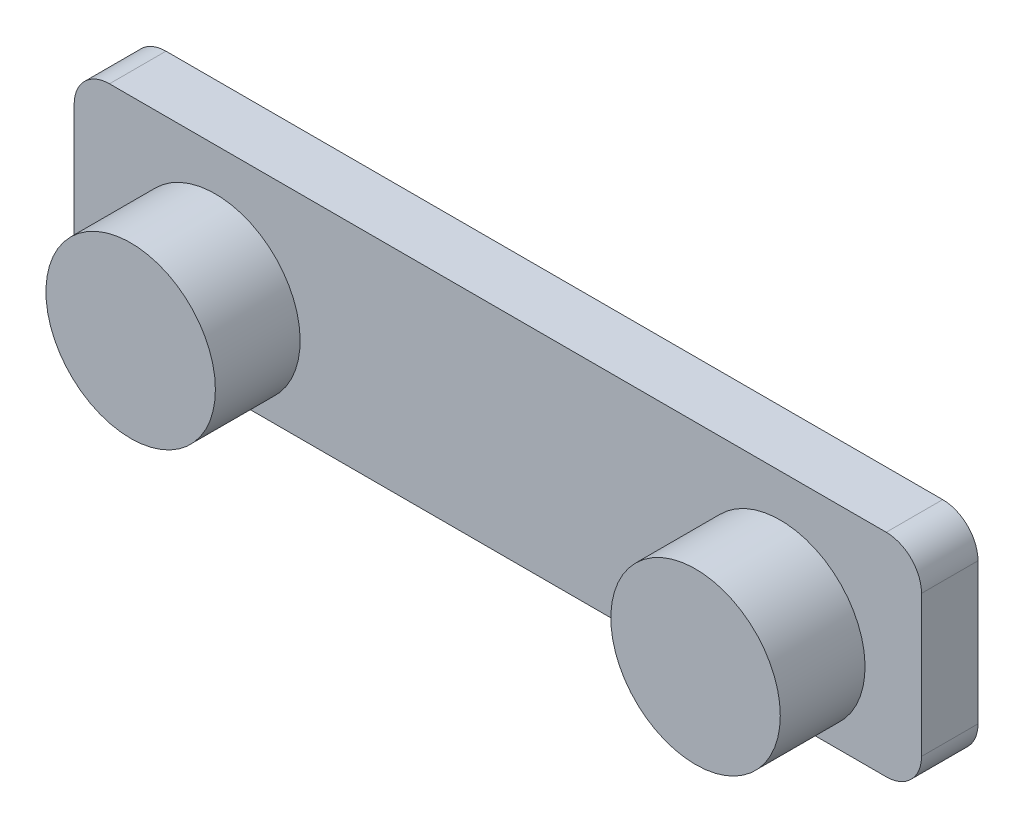
ISO-10303-21;
HEADER;
FILE_DESCRIPTION(('STEP AP214'),'2;1');
FILE_NAME('part.step','',(''),(''),'','','');
FILE_SCHEMA(('AUTOMOTIVE_DESIGN { 1 0 10303 214 1 1 1 1 }'));
ENDSEC;
DATA;
#1=APPLICATION_CONTEXT('core data for automotive mechanical design processes');
#2=APPLICATION_PROTOCOL_DEFINITION('international standard','automotive_design',2000,#1);
#3=PRODUCT_CONTEXT('',#1,'mechanical');
#4=PRODUCT('Part','Part','',(#3));
#5=PRODUCT_RELATED_PRODUCT_CATEGORY('part','',(#4));
#6=PRODUCT_DEFINITION_FORMATION('','',#4);
#7=PRODUCT_DEFINITION_CONTEXT('part definition',#1,'design');
#8=PRODUCT_DEFINITION('design','',#6,#7);
#9=PRODUCT_DEFINITION_SHAPE('','',#8);
#10=(LENGTH_UNIT() NAMED_UNIT(*) SI_UNIT(.MILLI.,.METRE.));
#11=(NAMED_UNIT(*) PLANE_ANGLE_UNIT() SI_UNIT($,.RADIAN.));
#12=(NAMED_UNIT(*) SI_UNIT($,.STERADIAN.) SOLID_ANGLE_UNIT());
#13=UNCERTAINTY_MEASURE_WITH_UNIT(LENGTH_MEASURE(1.E-05),#10,'distance_accuracy_value','');
#14=(GEOMETRIC_REPRESENTATION_CONTEXT(3) GLOBAL_UNCERTAINTY_ASSIGNED_CONTEXT((#13)) GLOBAL_UNIT_ASSIGNED_CONTEXT((#10,
#11,#12)) REPRESENTATION_CONTEXT('',''));
#15=CARTESIAN_POINT('',(0.,0.,0.));
#16=DIRECTION('',(0.,0.,1.));
#17=DIRECTION('',(1.,0.,0.));
#18=AXIS2_PLACEMENT_3D('',#15,#16,#17);
#19=CARTESIAN_POINT('',(85.,25.,8.));
#20=DIRECTION('',(0.,0.,-1.));
#21=DIRECTION('',(-1.,0.,0.));
#22=AXIS2_PLACEMENT_3D('',#19,#20,#21);
#23=CYLINDRICAL_SURFACE('',#22,5.);
#24=CARTESIAN_POINT('',(85.,25.,0.));
#25=DIRECTION('',(0.,0.,1.));
#26=DIRECTION('',(1.,0.,0.));
#27=AXIS2_PLACEMENT_3D('',#24,#25,#26);
#28=CIRCLE('',#27,5.);
#29=CARTESIAN_POINT('',(85.,30.,0.));
#30=VERTEX_POINT('',#29);
#31=CARTESIAN_POINT('',(80.,25.,0.));
#32=VERTEX_POINT('',#31);
#33=EDGE_CURVE('E130',#30,#32,#28,.T.);
#34=ORIENTED_EDGE('',*,*,#33,.T.);
#35=DIRECTION('',(0.,0.,-1.));
#36=VECTOR('',#35,1.);
#37=CARTESIAN_POINT('',(80.,25.,8.));
#38=LINE('',#37,#36);
#39=CARTESIAN_POINT('',(80.,25.,8.));
#40=VERTEX_POINT('',#39);
#41=EDGE_CURVE('E11',#40,#32,#38,.T.);
#42=ORIENTED_EDGE('',*,*,#41,.F.);
#43=CARTESIAN_POINT('',(85.,25.,8.));
#44=DIRECTION('',(0.,0.,1.));
#45=DIRECTION('',(1.,0.,0.));
#46=AXIS2_PLACEMENT_3D('',#43,#44,#45);
#47=CIRCLE('',#46,5.);
#48=CARTESIAN_POINT('',(85.,30.,8.));
#49=VERTEX_POINT('',#48);
#50=EDGE_CURVE('E117',#49,#40,#47,.T.);
#51=ORIENTED_EDGE('',*,*,#50,.F.);
#52=DIRECTION('',(0.,0.,-1.));
#53=VECTOR('',#52,1.);
#54=CARTESIAN_POINT('',(85.,30.,8.));
#55=LINE('',#54,#53);
#56=EDGE_CURVE('E131',#49,#30,#55,.T.);
#57=ORIENTED_EDGE('',*,*,#56,.T.);
#58=EDGE_LOOP('',(#34,#42,#51,#57));
#59=FACE_BOUND('',#58,.T.);
#60=ADVANCED_FACE('F41',(#59),#23,.T.);
#61=CARTESIAN_POINT('',(80.,25.,8.));
#62=DIRECTION('',(1.,0.,0.));
#63=DIRECTION('',(0.,0.,-1.));
#64=AXIS2_PLACEMENT_3D('',#61,#62,#63);
#65=PLANE('',#64);
#66=DIRECTION('',(0.,-1.,0.));
#67=VECTOR('',#66,1.);
#68=CARTESIAN_POINT('',(80.,25.,0.));
#69=LINE('',#68,#67);
#70=CARTESIAN_POINT('',(80.,5.,0.));
#71=VERTEX_POINT('',#70);
#72=EDGE_CURVE('E134',#32,#71,#69,.T.);
#73=ORIENTED_EDGE('',*,*,#72,.T.);
#74=DIRECTION('',(0.,0.,-1.));
#75=VECTOR('',#74,1.);
#76=CARTESIAN_POINT('',(80.,5.,8.));
#77=LINE('',#76,#75);
#78=CARTESIAN_POINT('',(80.,5.,8.));
#79=VERTEX_POINT('',#78);
#80=EDGE_CURVE('E48',#79,#71,#77,.T.);
#81=ORIENTED_EDGE('',*,*,#80,.F.);
#82=DIRECTION('',(0.,-1.,0.));
#83=VECTOR('',#82,1.);
#84=CARTESIAN_POINT('',(80.,25.,8.));
#85=LINE('',#84,#83);
#86=EDGE_CURVE('E108',#40,#79,#85,.T.);
#87=ORIENTED_EDGE('',*,*,#86,.F.);
#88=ORIENTED_EDGE('',*,*,#41,.T.);
#89=EDGE_LOOP('',(#73,#81,#87,#88));
#90=FACE_BOUND('',#89,.T.);
#91=ADVANCED_FACE('F110',(#90),#65,.F.);
#92=CARTESIAN_POINT('',(85.,5.,8.));
#93=DIRECTION('',(0.,0.,-1.));
#94=DIRECTION('',(-1.,0.,0.));
#95=AXIS2_PLACEMENT_3D('',#92,#93,#94);
#96=CYLINDRICAL_SURFACE('',#95,5.);
#97=CARTESIAN_POINT('',(85.,5.,0.));
#98=DIRECTION('',(0.,0.,1.));
#99=DIRECTION('',(-1.,0.,0.));
#100=AXIS2_PLACEMENT_3D('',#97,#98,#99);
#101=CIRCLE('',#100,5.);
#102=CARTESIAN_POINT('',(85.,0.,0.));
#103=VERTEX_POINT('',#102);
#104=EDGE_CURVE('E136',#71,#103,#101,.T.);
#105=ORIENTED_EDGE('',*,*,#104,.T.);
#106=DIRECTION('',(0.,0.,-1.));
#107=VECTOR('',#106,1.);
#108=CARTESIAN_POINT('',(85.,0.,8.));
#109=LINE('',#108,#107);
#110=CARTESIAN_POINT('',(85.,0.,8.));
#111=VERTEX_POINT('',#110);
#112=EDGE_CURVE('E166',#111,#103,#109,.T.);
#113=ORIENTED_EDGE('',*,*,#112,.F.);
#114=CARTESIAN_POINT('',(85.,5.,8.));
#115=DIRECTION('',(0.,0.,1.));
#116=DIRECTION('',(-1.,0.,0.));
#117=AXIS2_PLACEMENT_3D('',#114,#115,#116);
#118=CIRCLE('',#117,5.);
#119=EDGE_CURVE('E116',#79,#111,#118,.T.);
#120=ORIENTED_EDGE('',*,*,#119,.F.);
#121=ORIENTED_EDGE('',*,*,#80,.T.);
#122=EDGE_LOOP('',(#105,#113,#120,#121));
#123=FACE_BOUND('',#122,.T.);
#124=ADVANCED_FACE('F170',(#123),#96,.T.);
#125=CARTESIAN_POINT('',(85.,0.,8.));
#126=DIRECTION('',(0.,1.,0.));
#127=DIRECTION('',(0.,0.,1.));
#128=AXIS2_PLACEMENT_3D('',#125,#126,#127);
#129=PLANE('',#128);
#130=DIRECTION('',(1.,0.,0.));
#131=VECTOR('',#130,1.);
#132=CARTESIAN_POINT('',(85.,0.,0.));
#133=LINE('',#132,#131);
#134=CARTESIAN_POINT('',(195.,0.,0.));
#135=VERTEX_POINT('',#134);
#136=EDGE_CURVE('E144',#103,#135,#133,.T.);
#137=ORIENTED_EDGE('',*,*,#136,.T.);
#138=DIRECTION('',(0.,0.,-1.));
#139=VECTOR('',#138,1.);
#140=CARTESIAN_POINT('',(195.,0.,8.));
#141=LINE('',#140,#139);
#142=CARTESIAN_POINT('',(195.,0.,8.));
#143=VERTEX_POINT('',#142);
#144=EDGE_CURVE('E163',#143,#135,#141,.T.);
#145=ORIENTED_EDGE('',*,*,#144,.F.);
#146=DIRECTION('',(1.,0.,0.));
#147=VECTOR('',#146,1.);
#148=CARTESIAN_POINT('',(85.,0.,8.));
#149=LINE('',#148,#147);
#150=CARTESIAN_POINT('',(180.,0.,8.));
#151=VERTEX_POINT('',#150);
#152=EDGE_CURVE('E195',#151,#143,#149,.T.);
#153=ORIENTED_EDGE('',*,*,#152,.F.);
#154=CARTESIAN_POINT('',(100.,0.,8.));
#155=VERTEX_POINT('',#154);
#156=EDGE_CURVE('E193',#155,#151,#149,.T.);
#157=ORIENTED_EDGE('',*,*,#156,.F.);
#158=EDGE_CURVE('E188',#111,#155,#149,.T.);
#159=ORIENTED_EDGE('',*,*,#158,.F.);
#160=ORIENTED_EDGE('',*,*,#112,.T.);
#161=EDGE_LOOP('',(#137,#145,#153,#157,#159,#160));
#162=FACE_BOUND('',#161,.T.);
#163=ADVANCED_FACE('F178',(#162),#129,.F.);
#164=CARTESIAN_POINT('',(195.,5.,8.));
#165=DIRECTION('',(0.,0.,-1.));
#166=DIRECTION('',(-1.,0.,0.));
#167=AXIS2_PLACEMENT_3D('',#164,#165,#166);
#168=CYLINDRICAL_SURFACE('',#167,5.);
#169=CARTESIAN_POINT('',(195.,5.,0.));
#170=DIRECTION('',(0.,0.,1.));
#171=DIRECTION('',(1.,0.,0.));
#172=AXIS2_PLACEMENT_3D('',#169,#170,#171);
#173=CIRCLE('',#172,5.);
#174=CARTESIAN_POINT('',(200.,5.00000000000004,0.));
#175=VERTEX_POINT('',#174);
#176=EDGE_CURVE('E146',#135,#175,#173,.T.);
#177=ORIENTED_EDGE('',*,*,#176,.T.);
#178=DIRECTION('',(0.,0.,-1.));
#179=VECTOR('',#178,1.);
#180=CARTESIAN_POINT('',(200.,5.00000000000004,8.));
#181=LINE('',#180,#179);
#182=CARTESIAN_POINT('',(200.,5.00000000000004,8.));
#183=VERTEX_POINT('',#182);
#184=EDGE_CURVE('E160',#183,#175,#181,.T.);
#185=ORIENTED_EDGE('',*,*,#184,.F.);
#186=CARTESIAN_POINT('',(195.,5.,8.));
#187=DIRECTION('',(0.,0.,1.));
#188=DIRECTION('',(1.,0.,0.));
#189=AXIS2_PLACEMENT_3D('',#186,#187,#188);
#190=CIRCLE('',#189,5.);
#191=EDGE_CURVE('E185',#143,#183,#190,.T.);
#192=ORIENTED_EDGE('',*,*,#191,.F.);
#193=ORIENTED_EDGE('',*,*,#144,.T.);
#194=EDGE_LOOP('',(#177,#185,#192,#193));
#195=FACE_BOUND('',#194,.T.);
#196=ADVANCED_FACE('F183',(#195),#168,.T.);
#197=CARTESIAN_POINT('',(200.,5.00000000000004,8.));
#198=DIRECTION('',(-1.,0.,0.));
#199=DIRECTION('',(0.,0.,1.));
#200=AXIS2_PLACEMENT_3D('',#197,#198,#199);
#201=PLANE('',#200);
#202=DIRECTION('',(0.,1.,0.));
#203=VECTOR('',#202,1.);
#204=CARTESIAN_POINT('',(200.,5.00000000000004,0.));
#205=LINE('',#204,#203);
#206=CARTESIAN_POINT('',(200.,25.,0.));
#207=VERTEX_POINT('',#206);
#208=EDGE_CURVE('E148',#175,#207,#205,.T.);
#209=ORIENTED_EDGE('',*,*,#208,.T.);
#210=DIRECTION('',(0.,0.,-1.));
#211=VECTOR('',#210,1.);
#212=CARTESIAN_POINT('',(200.,25.,8.));
#213=LINE('',#212,#211);
#214=CARTESIAN_POINT('',(200.,25.,8.));
#215=VERTEX_POINT('',#214);
#216=EDGE_CURVE('E157',#215,#207,#213,.T.);
#217=ORIENTED_EDGE('',*,*,#216,.F.);
#218=DIRECTION('',(0.,1.,0.));
#219=VECTOR('',#218,1.);
#220=CARTESIAN_POINT('',(200.,5.00000000000004,8.));
#221=LINE('',#220,#219);
#222=EDGE_CURVE('E187',#183,#215,#221,.T.);
#223=ORIENTED_EDGE('',*,*,#222,.F.);
#224=ORIENTED_EDGE('',*,*,#184,.T.);
#225=EDGE_LOOP('',(#209,#217,#223,#224));
#226=FACE_BOUND('',#225,.T.);
#227=ADVANCED_FACE('F206',(#226),#201,.F.);
#228=CARTESIAN_POINT('',(195.,25.,8.));
#229=DIRECTION('',(0.,0.,-1.));
#230=DIRECTION('',(-1.,0.,0.));
#231=AXIS2_PLACEMENT_3D('',#228,#229,#230);
#232=CYLINDRICAL_SURFACE('',#231,5.);
#233=CARTESIAN_POINT('',(195.,25.,0.));
#234=DIRECTION('',(0.,0.,1.));
#235=DIRECTION('',(1.,0.,0.));
#236=AXIS2_PLACEMENT_3D('',#233,#234,#235);
#237=CIRCLE('',#236,5.);
#238=CARTESIAN_POINT('',(195.,30.,0.));
#239=VERTEX_POINT('',#238);
#240=EDGE_CURVE('E150',#207,#239,#237,.T.);
#241=ORIENTED_EDGE('',*,*,#240,.T.);
#242=DIRECTION('',(0.,0.,-1.));
#243=VECTOR('',#242,1.);
#244=CARTESIAN_POINT('',(195.,30.,8.));
#245=LINE('',#244,#243);
#246=CARTESIAN_POINT('',(195.,30.,8.));
#247=VERTEX_POINT('',#246);
#248=EDGE_CURVE('E154',#247,#239,#245,.T.);
#249=ORIENTED_EDGE('',*,*,#248,.F.);
#250=CARTESIAN_POINT('',(195.,25.,8.));
#251=DIRECTION('',(0.,0.,1.));
#252=DIRECTION('',(1.,0.,0.));
#253=AXIS2_PLACEMENT_3D('',#250,#251,#252);
#254=CIRCLE('',#253,5.);
#255=EDGE_CURVE('E190',#215,#247,#254,.T.);
#256=ORIENTED_EDGE('',*,*,#255,.F.);
#257=ORIENTED_EDGE('',*,*,#216,.T.);
#258=EDGE_LOOP('',(#241,#249,#256,#257));
#259=FACE_BOUND('',#258,.T.);
#260=ADVANCED_FACE('F201',(#259),#232,.T.);
#261=CARTESIAN_POINT('',(195.,30.,8.));
#262=DIRECTION('',(0.,-1.,0.));
#263=DIRECTION('',(0.,0.,-1.));
#264=AXIS2_PLACEMENT_3D('',#261,#262,#263);
#265=PLANE('',#264);
#266=DIRECTION('',(-1.,0.,0.));
#267=VECTOR('',#266,1.);
#268=CARTESIAN_POINT('',(195.,30.,0.));
#269=LINE('',#268,#267);
#270=EDGE_CURVE('E127',#239,#30,#269,.T.);
#271=ORIENTED_EDGE('',*,*,#270,.T.);
#272=ORIENTED_EDGE('',*,*,#56,.F.);
#273=DIRECTION('',(-1.,0.,0.));
#274=VECTOR('',#273,1.);
#275=CARTESIAN_POINT('',(195.,30.,8.));
#276=LINE('',#275,#274);
#277=EDGE_CURVE('E123',#247,#49,#276,.T.);
#278=ORIENTED_EDGE('',*,*,#277,.F.);
#279=ORIENTED_EDGE('',*,*,#248,.T.);
#280=EDGE_LOOP('',(#271,#272,#278,#279));
#281=FACE_BOUND('',#280,.T.);
#282=ADVANCED_FACE('F204',(#281),#265,.F.);
#283=CARTESIAN_POINT('',(85.,25.,8.));
#284=DIRECTION('',(0.,0.,1.));
#285=DIRECTION('',(1.,0.,0.));
#286=AXIS2_PLACEMENT_3D('',#283,#284,#285);
#287=PLANE('',#286);
#288=ORIENTED_EDGE('',*,*,#156,.T.);
#289=CARTESIAN_POINT('',(180.,12.,8.));
#290=DIRECTION('',(0.,0.,1.));
#291=DIRECTION('',(1.,0.,0.));
#292=AXIS2_PLACEMENT_3D('',#289,#290,#291);
#293=CIRCLE('',#292,12.);
#294=EDGE_CURVE('E53',#151,#151,#293,.F.);
#295=ORIENTED_EDGE('',*,*,#294,.T.);
#296=ORIENTED_EDGE('',*,*,#152,.T.);
#297=ORIENTED_EDGE('',*,*,#191,.T.);
#298=ORIENTED_EDGE('',*,*,#222,.T.);
#299=ORIENTED_EDGE('',*,*,#255,.T.);
#300=ORIENTED_EDGE('',*,*,#277,.T.);
#301=ORIENTED_EDGE('',*,*,#50,.T.);
#302=ORIENTED_EDGE('',*,*,#86,.T.);
#303=ORIENTED_EDGE('',*,*,#119,.T.);
#304=ORIENTED_EDGE('',*,*,#158,.T.);
#305=CARTESIAN_POINT('',(100.,12.,8.));
#306=DIRECTION('',(0.,0.,1.));
#307=DIRECTION('',(1.,0.,0.));
#308=AXIS2_PLACEMENT_3D('',#305,#306,#307);
#309=CIRCLE('',#308,12.);
#310=EDGE_CURVE('E58',#155,#155,#309,.F.);
#311=ORIENTED_EDGE('',*,*,#310,.T.);
#312=EDGE_LOOP('',(#288,#295,#296,#297,#298,#299,#300,#301,#302,#303,#304,#311));
#313=FACE_BOUND('',#312,.T.);
#314=ADVANCED_FACE('F121',(#313),#287,.T.);
#315=CARTESIAN_POINT('',(85.,25.,0.));
#316=DIRECTION('',(0.,0.,1.));
#317=DIRECTION('',(1.,0.,0.));
#318=AXIS2_PLACEMENT_3D('',#315,#316,#317);
#319=PLANE('',#318);
#320=ORIENTED_EDGE('',*,*,#176,.F.);
#321=ORIENTED_EDGE('',*,*,#136,.F.);
#322=ORIENTED_EDGE('',*,*,#104,.F.);
#323=ORIENTED_EDGE('',*,*,#72,.F.);
#324=ORIENTED_EDGE('',*,*,#33,.F.);
#325=ORIENTED_EDGE('',*,*,#270,.F.);
#326=ORIENTED_EDGE('',*,*,#240,.F.);
#327=ORIENTED_EDGE('',*,*,#208,.F.);
#328=EDGE_LOOP('',(#320,#321,#322,#323,#324,#325,#326,#327));
#329=FACE_BOUND('',#328,.T.);
#330=ADVANCED_FACE('F174',(#329),#319,.F.);
#331=CARTESIAN_POINT('',(100.,12.,20.));
#332=DIRECTION('',(0.,0.,-1.));
#333=DIRECTION('',(-1.,0.,0.));
#334=AXIS2_PLACEMENT_3D('',#331,#332,#333);
#335=CYLINDRICAL_SURFACE('',#334,12.);
#336=ORIENTED_EDGE('',*,*,#310,.F.);
#337=EDGE_LOOP('',(#336));
#338=FACE_BOUND('',#337,.T.);
#339=CARTESIAN_POINT('',(100.,12.,20.));
#340=DIRECTION('',(0.,0.,1.));
#341=DIRECTION('',(1.,0.,0.));
#342=AXIS2_PLACEMENT_3D('',#339,#340,#341);
#343=CIRCLE('',#342,12.);
#344=CARTESIAN_POINT('',(112.,12.,20.));
#345=VERTEX_POINT('',#344);
#346=EDGE_CURVE('E138',#345,#345,#343,.T.);
#347=ORIENTED_EDGE('',*,*,#346,.F.);
#348=EDGE_LOOP('',(#347));
#349=FACE_BOUND('',#348,.T.);
#350=ADVANCED_FACE('F249',(#338,#349),#335,.T.);
#351=CARTESIAN_POINT('',(100.,12.,20.));
#352=DIRECTION('',(0.,0.,1.));
#353=DIRECTION('',(1.,0.,0.));
#354=AXIS2_PLACEMENT_3D('',#351,#352,#353);
#355=PLANE('',#354);
#356=ORIENTED_EDGE('',*,*,#346,.T.);
#357=EDGE_LOOP('',(#356));
#358=FACE_BOUND('',#357,.T.);
#359=ADVANCED_FACE('F234',(#358),#355,.T.);
#360=CARTESIAN_POINT('',(180.,12.,20.));
#361=DIRECTION('',(0.,0.,-1.));
#362=DIRECTION('',(-1.,0.,0.));
#363=AXIS2_PLACEMENT_3D('',#360,#361,#362);
#364=CYLINDRICAL_SURFACE('',#363,12.);
#365=ORIENTED_EDGE('',*,*,#294,.F.);
#366=EDGE_LOOP('',(#365));
#367=FACE_BOUND('',#366,.T.);
#368=CARTESIAN_POINT('',(180.,12.,20.));
#369=DIRECTION('',(0.,0.,1.));
#370=DIRECTION('',(1.,0.,0.));
#371=AXIS2_PLACEMENT_3D('',#368,#369,#370);
#372=CIRCLE('',#371,12.);
#373=CARTESIAN_POINT('',(192.,12.,20.));
#374=VERTEX_POINT('',#373);
#375=EDGE_CURVE('E327',#374,#374,#372,.T.);
#376=ORIENTED_EDGE('',*,*,#375,.F.);
#377=EDGE_LOOP('',(#376));
#378=FACE_BOUND('',#377,.T.);
#379=ADVANCED_FACE('F255',(#367,#378),#364,.T.);
#380=CARTESIAN_POINT('',(180.,12.,20.));
#381=DIRECTION('',(0.,0.,1.));
#382=DIRECTION('',(1.,0.,0.));
#383=AXIS2_PLACEMENT_3D('',#380,#381,#382);
#384=PLANE('',#383);
#385=ORIENTED_EDGE('',*,*,#375,.T.);
#386=EDGE_LOOP('',(#385));
#387=FACE_BOUND('',#386,.T.);
#388=ADVANCED_FACE('F259',(#387),#384,.T.);
#389=CLOSED_SHELL('',(#60,#91,#124,#163,#196,#227,#260,#282,#314,#330,#350,#359,#379,#388));
#390=MANIFOLD_SOLID_BREP('B2',#389);
#391=ADVANCED_BREP_SHAPE_REPRESENTATION('',(#18,#390),#14);
#392=SHAPE_DEFINITION_REPRESENTATION(#9,#391);
ENDSEC;
END-ISO-10303-21;
